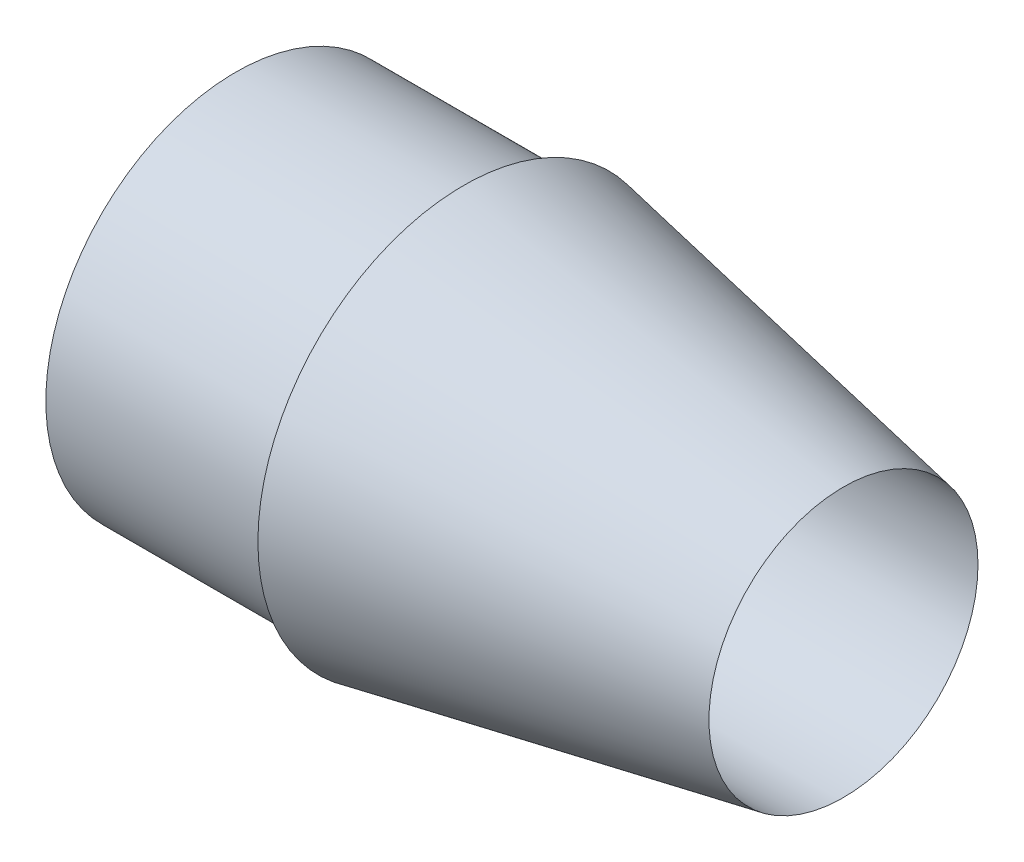
ISO-10303-21;
HEADER;
FILE_DESCRIPTION(('STEP AP214'),'2;1');
FILE_NAME('part.step','',(''),(''),'','','');
FILE_SCHEMA(('AUTOMOTIVE_DESIGN { 1 0 10303 214 1 1 1 1 }'));
ENDSEC;
DATA;
#1=APPLICATION_CONTEXT('core data for automotive mechanical design processes');
#2=APPLICATION_PROTOCOL_DEFINITION('international standard','automotive_design',2000,#1);
#3=PRODUCT_CONTEXT('',#1,'mechanical');
#4=PRODUCT('Part','Part','',(#3));
#5=PRODUCT_RELATED_PRODUCT_CATEGORY('part','',(#4));
#6=PRODUCT_DEFINITION_FORMATION('','',#4);
#7=PRODUCT_DEFINITION_CONTEXT('part definition',#1,'design');
#8=PRODUCT_DEFINITION('design','',#6,#7);
#9=PRODUCT_DEFINITION_SHAPE('','',#8);
#10=(LENGTH_UNIT() NAMED_UNIT(*) SI_UNIT(.MILLI.,.METRE.));
#11=(NAMED_UNIT(*) PLANE_ANGLE_UNIT() SI_UNIT($,.RADIAN.));
#12=(NAMED_UNIT(*) SI_UNIT($,.STERADIAN.) SOLID_ANGLE_UNIT());
#13=UNCERTAINTY_MEASURE_WITH_UNIT(LENGTH_MEASURE(1.E-05),#10,'distance_accuracy_value','');
#14=(GEOMETRIC_REPRESENTATION_CONTEXT(3) GLOBAL_UNCERTAINTY_ASSIGNED_CONTEXT((#13)) GLOBAL_UNIT_ASSIGNED_CONTEXT((#10,
#11,#12)) REPRESENTATION_CONTEXT('',''));
#15=CARTESIAN_POINT('',(0.,0.,0.));
#16=DIRECTION('',(0.,0.,1.));
#17=DIRECTION('',(1.,0.,0.));
#18=AXIS2_PLACEMENT_3D('',#15,#16,#17);
#19=CARTESIAN_POINT('',(0.,25.4,0.));
#20=DIRECTION('',(1.,0.,0.));
#21=DIRECTION('',(0.,0.,-1.));
#22=AXIS2_PLACEMENT_3D('',#19,#20,#21);
#23=PLANE('',#22);
#24=CARTESIAN_POINT('',(0.,0.,0.));
#25=DIRECTION('',(1.,0.,0.));
#26=DIRECTION('',(0.,0.,-1.));
#27=AXIS2_PLACEMENT_3D('',#24,#25,#26);
#28=CIRCLE('',#27,26.9875);
#29=CARTESIAN_POINT('',(0.,0.,-26.9875));
#30=VERTEX_POINT('',#29);
#31=EDGE_CURVE('E78',#30,#30,#28,.T.);
#32=ORIENTED_EDGE('',*,*,#31,.T.);
#33=EDGE_LOOP('',(#32));
#34=FACE_BOUND('',#33,.T.);
#35=CARTESIAN_POINT('',(0.,0.,0.));
#36=DIRECTION('',(1.,0.,0.));
#37=DIRECTION('',(0.,0.,-1.));
#38=AXIS2_PLACEMENT_3D('',#35,#36,#37);
#39=CIRCLE('',#38,25.4);
#40=CARTESIAN_POINT('',(0.,0.,-25.4));
#41=VERTEX_POINT('',#40);
#42=EDGE_CURVE('E10',#41,#41,#39,.T.);
#43=ORIENTED_EDGE('',*,*,#42,.F.);
#44=EDGE_LOOP('',(#43));
#45=FACE_BOUND('',#44,.T.);
#46=ADVANCED_FACE('F43',(#34,#45),#23,.T.);
#47=CARTESIAN_POINT('',(0.,0.,0.));
#48=DIRECTION('',(1.,0.,0.));
#49=DIRECTION('',(0.,0.,-1.));
#50=AXIS2_PLACEMENT_3D('',#47,#48,#49);
#51=TOROIDAL_SURFACE('',#50,38.1,12.7);
#52=ORIENTED_EDGE('',*,*,#42,.T.);
#53=EDGE_LOOP('',(#52));
#54=FACE_BOUND('',#53,.T.);
#55=CARTESIAN_POINT('',(-2.66547675836307,0.,0.));
#56=DIRECTION('',(1.,0.,0.));
#57=DIRECTION('',(0.,0.,-1.));
#58=AXIS2_PLACEMENT_3D('',#55,#56,#57);
#59=CIRCLE('',#58,25.6828653204281);
#60=CARTESIAN_POINT('',(-2.66547675836307,0.,-25.6828653204281));
#61=VERTEX_POINT('',#60);
#62=EDGE_CURVE('E50',#61,#61,#59,.T.);
#63=ORIENTED_EDGE('',*,*,#62,.F.);
#64=EDGE_LOOP('',(#63));
#65=FACE_BOUND('',#64,.T.);
#66=ADVANCED_FACE('F97',(#54,#65),#51,.T.);
#67=CARTESIAN_POINT('',(-45.72,0.,0.));
#68=DIRECTION('',(-1.,0.,0.));
#69=DIRECTION('',(0.,0.,1.));
#70=AXIS2_PLACEMENT_3D('',#67,#68,#69);
#71=CONICAL_SURFACE('',#70,34.925,0.211452285587574);
#72=ORIENTED_EDGE('',*,*,#62,.T.);
#73=EDGE_LOOP('',(#72));
#74=FACE_BOUND('',#73,.T.);
#75=CARTESIAN_POINT('',(-45.72,0.,0.));
#76=DIRECTION('',(1.,0.,0.));
#77=DIRECTION('',(0.,0.,-1.));
#78=AXIS2_PLACEMENT_3D('',#75,#76,#77);
#79=CIRCLE('',#78,34.925);
#80=CARTESIAN_POINT('',(-45.72,0.,-34.925));
#81=VERTEX_POINT('',#80);
#82=EDGE_CURVE('E55',#81,#81,#79,.T.);
#83=ORIENTED_EDGE('',*,*,#82,.F.);
#84=EDGE_LOOP('',(#83));
#85=FACE_BOUND('',#84,.T.);
#86=ADVANCED_FACE('F101',(#74,#85),#71,.F.);
#87=CARTESIAN_POINT('',(-45.72,38.1,0.));
#88=DIRECTION('',(-1.,0.,0.));
#89=DIRECTION('',(0.,0.,1.));
#90=AXIS2_PLACEMENT_3D('',#87,#88,#89);
#91=PLANE('',#90);
#92=ORIENTED_EDGE('',*,*,#82,.T.);
#93=EDGE_LOOP('',(#92));
#94=FACE_BOUND('',#93,.T.);
#95=CARTESIAN_POINT('',(-45.72,0.,0.));
#96=DIRECTION('',(1.,0.,0.));
#97=DIRECTION('',(0.,0.,-1.));
#98=AXIS2_PLACEMENT_3D('',#95,#96,#97);
#99=CIRCLE('',#98,38.1);
#100=CARTESIAN_POINT('',(-45.72,0.,-38.1));
#101=VERTEX_POINT('',#100);
#102=EDGE_CURVE('E60',#101,#101,#99,.T.);
#103=ORIENTED_EDGE('',*,*,#102,.F.);
#104=EDGE_LOOP('',(#103));
#105=FACE_BOUND('',#104,.T.);
#106=ADVANCED_FACE('F105',(#94,#105),#91,.T.);
#107=CARTESIAN_POINT('',(109.22,0.,0.));
#108=DIRECTION('',(1.,0.,0.));
#109=DIRECTION('',(0.,0.,-1.));
#110=AXIS2_PLACEMENT_3D('',#107,#108,#109);
#111=CYLINDRICAL_SURFACE('',#110,38.1);
#112=ORIENTED_EDGE('',*,*,#102,.T.);
#113=EDGE_LOOP('',(#112));
#114=FACE_BOUND('',#113,.T.);
#115=CARTESIAN_POINT('',(0.,0.,0.));
#116=DIRECTION('',(1.,0.,0.));
#117=DIRECTION('',(0.,0.,-1.));
#118=AXIS2_PLACEMENT_3D('',#115,#116,#117);
#119=CIRCLE('',#118,38.1);
#120=CARTESIAN_POINT('',(0.,0.,-38.1));
#121=VERTEX_POINT('',#120);
#122=EDGE_CURVE('E66',#121,#121,#119,.T.);
#123=ORIENTED_EDGE('',*,*,#122,.F.);
#124=EDGE_LOOP('',(#123));
#125=FACE_BOUND('',#124,.T.);
#126=ADVANCED_FACE('F111',(#114,#125),#111,.T.);
#127=CARTESIAN_POINT('',(0.,41.275,0.));
#128=DIRECTION('',(-1.,0.,0.));
#129=DIRECTION('',(0.,0.,1.));
#130=AXIS2_PLACEMENT_3D('',#127,#128,#129);
#131=PLANE('',#130);
#132=ORIENTED_EDGE('',*,*,#122,.T.);
#133=EDGE_LOOP('',(#132));
#134=FACE_BOUND('',#133,.T.);
#135=CARTESIAN_POINT('',(0.,0.,0.));
#136=DIRECTION('',(1.,0.,0.));
#137=DIRECTION('',(0.,0.,-1.));
#138=AXIS2_PLACEMENT_3D('',#135,#136,#137);
#139=CIRCLE('',#138,41.275);
#140=CARTESIAN_POINT('',(0.,0.,-41.275));
#141=VERTEX_POINT('',#140);
#142=EDGE_CURVE('E70',#141,#141,#139,.T.);
#143=ORIENTED_EDGE('',*,*,#142,.F.);
#144=EDGE_LOOP('',(#143));
#145=FACE_BOUND('',#144,.T.);
#146=ADVANCED_FACE('F93',(#134,#145),#131,.T.);
#147=CARTESIAN_POINT('',(76.2,0.,0.));
#148=DIRECTION('',(-1.,0.,0.));
#149=DIRECTION('',(0.,0.,1.));
#150=AXIS2_PLACEMENT_3D('',#147,#148,#149);
#151=CONICAL_SURFACE('',#150,26.9875,0.185347949995695);
#152=ORIENTED_EDGE('',*,*,#142,.T.);
#153=EDGE_LOOP('',(#152));
#154=FACE_BOUND('',#153,.T.);
#155=CARTESIAN_POINT('',(76.2,0.,0.));
#156=DIRECTION('',(1.,0.,0.));
#157=DIRECTION('',(0.,0.,-1.));
#158=AXIS2_PLACEMENT_3D('',#155,#156,#157);
#159=CIRCLE('',#158,26.9875);
#160=CARTESIAN_POINT('',(76.2,0.,-26.9875));
#161=VERTEX_POINT('',#160);
#162=EDGE_CURVE('E74',#161,#161,#159,.T.);
#163=ORIENTED_EDGE('',*,*,#162,.F.);
#164=EDGE_LOOP('',(#163));
#165=FACE_BOUND('',#164,.T.);
#166=ADVANCED_FACE('F87',(#154,#165),#151,.T.);
#167=CARTESIAN_POINT('',(109.22,0.,0.));
#168=DIRECTION('',(1.,0.,0.));
#169=DIRECTION('',(0.,0.,-1.));
#170=AXIS2_PLACEMENT_3D('',#167,#168,#169);
#171=CYLINDRICAL_SURFACE('',#170,26.9875);
#172=ORIENTED_EDGE('',*,*,#162,.T.);
#173=EDGE_LOOP('',(#172));
#174=FACE_BOUND('',#173,.T.);
#175=ORIENTED_EDGE('',*,*,#31,.F.);
#176=EDGE_LOOP('',(#175));
#177=FACE_BOUND('',#176,.T.);
#178=ADVANCED_FACE('F85',(#174,#177),#171,.F.);
#179=CLOSED_SHELL('',(#46,#66,#86,#106,#126,#146,#166,#178));
#180=MANIFOLD_SOLID_BREP('B2',#179);
#181=ADVANCED_BREP_SHAPE_REPRESENTATION('',(#18,#180),#14);
#182=SHAPE_DEFINITION_REPRESENTATION(#9,#181);
ENDSEC;
END-ISO-10303-21;
